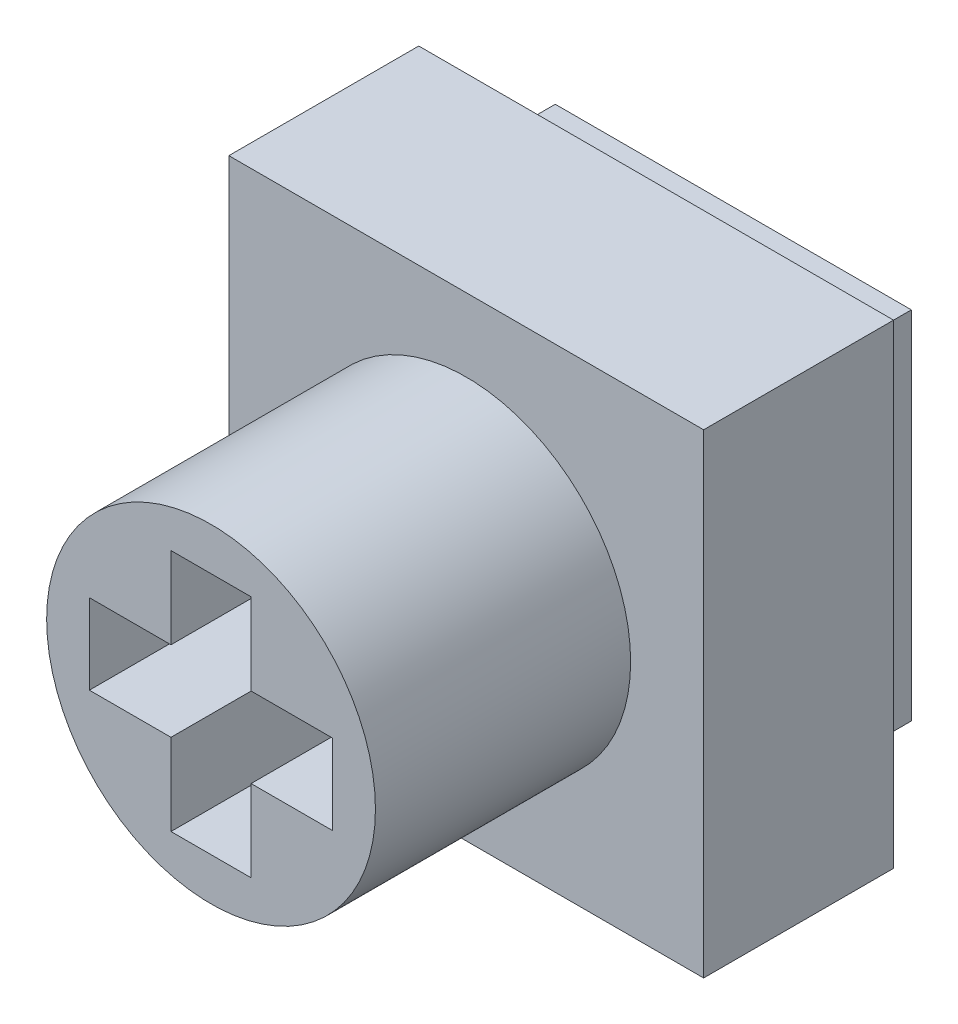
ISO-10303-21;
HEADER;
FILE_DESCRIPTION(('STEP AP214'),'2;1');
FILE_NAME('part.step','',(''),(''),'','','');
FILE_SCHEMA(('AUTOMOTIVE_DESIGN { 1 0 10303 214 1 1 1 1 }'));
ENDSEC;
DATA;
#1=APPLICATION_CONTEXT('core data for automotive mechanical design processes');
#2=APPLICATION_PROTOCOL_DEFINITION('international standard','automotive_design',2000,#1);
#3=PRODUCT_CONTEXT('',#1,'mechanical');
#4=PRODUCT('Part','Part','',(#3));
#5=PRODUCT_RELATED_PRODUCT_CATEGORY('part','',(#4));
#6=PRODUCT_DEFINITION_FORMATION('','',#4);
#7=PRODUCT_DEFINITION_CONTEXT('part definition',#1,'design');
#8=PRODUCT_DEFINITION('design','',#6,#7);
#9=PRODUCT_DEFINITION_SHAPE('','',#8);
#10=(LENGTH_UNIT() NAMED_UNIT(*) SI_UNIT(.MILLI.,.METRE.));
#11=(NAMED_UNIT(*) PLANE_ANGLE_UNIT() SI_UNIT($,.RADIAN.));
#12=(NAMED_UNIT(*) SI_UNIT($,.STERADIAN.) SOLID_ANGLE_UNIT());
#13=UNCERTAINTY_MEASURE_WITH_UNIT(LENGTH_MEASURE(1.E-05),#10,'distance_accuracy_value','');
#14=(GEOMETRIC_REPRESENTATION_CONTEXT(3) GLOBAL_UNCERTAINTY_ASSIGNED_CONTEXT((#13)) GLOBAL_UNIT_ASSIGNED_CONTEXT((#10,
#11,#12)) REPRESENTATION_CONTEXT('',''));
#15=CARTESIAN_POINT('',(0.,0.,0.));
#16=DIRECTION('',(0.,0.,1.));
#17=DIRECTION('',(1.,0.,0.));
#18=AXIS2_PLACEMENT_3D('',#15,#16,#17);
#19=CARTESIAN_POINT('',(0.,0.,0.));
#20=DIRECTION('',(0.,0.,1.));
#21=DIRECTION('',(1.,0.,0.));
#22=AXIS2_PLACEMENT_3D('',#19,#20,#21);
#23=PLANE('',#22);
#24=DIRECTION('',(0.,-1.,0.));
#25=VECTOR('',#24,1.);
#26=CARTESIAN_POINT('',(-3.99761136088125,-19.0657117710836,0.));
#27=LINE('',#26,#25);
#28=CARTESIAN_POINT('',(-3.99761136088125,-19.0657117710836,0.));
#29=VERTEX_POINT('',#28);
#30=CARTESIAN_POINT('',(-3.99761136088125,-27.0657117710836,0.));
#31=VERTEX_POINT('',#30);
#32=EDGE_CURVE('E200',#29,#31,#27,.T.);
#33=ORIENTED_EDGE('',*,*,#32,.F.);
#34=DIRECTION('',(-1.,0.,0.));
#35=VECTOR('',#34,1.);
#36=CARTESIAN_POINT('',(4.00238863911875,-19.0657117710836,0.));
#37=LINE('',#36,#35);
#38=CARTESIAN_POINT('',(4.00238863911875,-19.0657117710836,0.));
#39=VERTEX_POINT('',#38);
#40=EDGE_CURVE('E216',#39,#29,#37,.T.);
#41=ORIENTED_EDGE('',*,*,#40,.F.);
#42=DIRECTION('',(0.,1.,0.));
#43=VECTOR('',#42,1.);
#44=CARTESIAN_POINT('',(4.00238863911875,-19.0657117710836,0.));
#45=LINE('',#44,#43);
#46=CARTESIAN_POINT('',(4.00238863911875,-27.0657117710836,0.));
#47=VERTEX_POINT('',#46);
#48=EDGE_CURVE('E228',#47,#39,#45,.T.);
#49=ORIENTED_EDGE('',*,*,#48,.F.);
#50=DIRECTION('',(1.,0.,0.));
#51=VECTOR('',#50,1.);
#52=CARTESIAN_POINT('',(4.00238863911875,-27.0657117710836,0.));
#53=LINE('',#52,#51);
#54=EDGE_CURVE('E205',#31,#47,#53,.T.);
#55=ORIENTED_EDGE('',*,*,#54,.F.);
#56=EDGE_LOOP('',(#33,#41,#49,#55));
#57=FACE_BOUND('',#56,.T.);
#58=DIRECTION('',(0.,-1.,0.));
#59=VECTOR('',#58,1.);
#60=CARTESIAN_POINT('',(3.00238863911875,-20.0657117710836,0.));
#61=LINE('',#60,#59);
#62=CARTESIAN_POINT('',(3.00238863911875,-20.0657117710836,0.));
#63=VERTEX_POINT('',#62);
#64=CARTESIAN_POINT('',(3.00238863911875,-26.0657117710836,0.));
#65=VERTEX_POINT('',#64);
#66=EDGE_CURVE('E55',#63,#65,#61,.T.);
#67=ORIENTED_EDGE('',*,*,#66,.F.);
#68=DIRECTION('',(1.,0.,0.));
#69=VECTOR('',#68,1.);
#70=CARTESIAN_POINT('',(-2.99761136088125,-20.0657117710836,0.));
#71=LINE('',#70,#69);
#72=CARTESIAN_POINT('',(-2.99761136088125,-20.0657117710836,0.));
#73=VERTEX_POINT('',#72);
#74=EDGE_CURVE('E59',#73,#63,#71,.T.);
#75=ORIENTED_EDGE('',*,*,#74,.F.);
#76=DIRECTION('',(0.,1.,0.));
#77=VECTOR('',#76,1.);
#78=CARTESIAN_POINT('',(-2.99761136088125,-20.0657117710836,0.));
#79=LINE('',#78,#77);
#80=CARTESIAN_POINT('',(-2.99761136088125,-26.0657117710836,0.));
#81=VERTEX_POINT('',#80);
#82=EDGE_CURVE('E655',#81,#73,#79,.T.);
#83=ORIENTED_EDGE('',*,*,#82,.F.);
#84=DIRECTION('',(-1.,0.,0.));
#85=VECTOR('',#84,1.);
#86=CARTESIAN_POINT('',(-2.99761136088125,-26.0657117710836,0.));
#87=LINE('',#86,#85);
#88=EDGE_CURVE('E665',#65,#81,#87,.T.);
#89=ORIENTED_EDGE('',*,*,#88,.F.);
#90=EDGE_LOOP('',(#67,#75,#83,#89));
#91=FACE_BOUND('',#90,.T.);
#92=ADVANCED_FACE('F39',(#57,#91),#23,.F.);
#93=CARTESIAN_POINT('',(0.,-25.1157117710836,7.5));
#94=DIRECTION('',(0.,-1.,0.));
#95=DIRECTION('',(0.,0.,-1.));
#96=AXIS2_PLACEMENT_3D('',#93,#94,#95);
#97=PLANE('',#96);
#98=DIRECTION('',(1.,0.,0.));
#99=VECTOR('',#98,1.);
#100=CARTESIAN_POINT('',(0.,-25.1157117710836,3.2));
#101=LINE('',#100,#99);
#102=CARTESIAN_POINT('',(-0.67261136088125,-25.1157117710836,3.2));
#103=VERTEX_POINT('',#102);
#104=CARTESIAN_POINT('',(0.67738863911875,-25.1157117710836,3.2));
#105=VERTEX_POINT('',#104);
#106=EDGE_CURVE('E287',#103,#105,#101,.T.);
#107=ORIENTED_EDGE('',*,*,#106,.F.);
#108=DIRECTION('',(0.,0.,-1.));
#109=VECTOR('',#108,1.);
#110=CARTESIAN_POINT('',(-0.67261136088125,-25.1157117710836,7.5));
#111=LINE('',#110,#109);
#112=CARTESIAN_POINT('',(-0.67261136088125,-25.1157117710836,7.5));
#113=VERTEX_POINT('',#112);
#114=EDGE_CURVE('E48',#113,#103,#111,.T.);
#115=ORIENTED_EDGE('',*,*,#114,.F.);
#116=DIRECTION('',(-1.,0.,0.));
#117=VECTOR('',#116,1.);
#118=CARTESIAN_POINT('',(0.,-25.1157117710836,7.5));
#119=LINE('',#118,#117);
#120=CARTESIAN_POINT('',(0.67738863911875,-25.1157117710836,7.5));
#121=VERTEX_POINT('',#120);
#122=EDGE_CURVE('E290',#121,#113,#119,.T.);
#123=ORIENTED_EDGE('',*,*,#122,.F.);
#124=DIRECTION('',(0.,0.,-1.));
#125=VECTOR('',#124,1.);
#126=CARTESIAN_POINT('',(0.67738863911875,-25.1157117710836,7.5));
#127=LINE('',#126,#125);
#128=EDGE_CURVE('E327',#121,#105,#127,.T.);
#129=ORIENTED_EDGE('',*,*,#128,.T.);
#130=EDGE_LOOP('',(#107,#115,#123,#129));
#131=FACE_BOUND('',#130,.T.);
#132=ADVANCED_FACE('F41',(#131),#97,.F.);
#133=CARTESIAN_POINT('',(-0.672611360881257,0.,7.5));
#134=DIRECTION('',(-1.,0.,0.));
#135=DIRECTION('',(0.,-1.,0.));
#136=AXIS2_PLACEMENT_3D('',#133,#134,#135);
#137=PLANE('',#136);
#138=DIRECTION('',(0.,-1.,0.));
#139=VECTOR('',#138,1.);
#140=CARTESIAN_POINT('',(-0.672611360881257,0.,3.2));
#141=LINE('',#140,#139);
#142=CARTESIAN_POINT('',(-0.672611360881251,-23.7407117710836,3.2));
#143=VERTEX_POINT('',#142);
#144=EDGE_CURVE('E284',#143,#103,#141,.T.);
#145=ORIENTED_EDGE('',*,*,#144,.F.);
#146=DIRECTION('',(0.,0.,-1.));
#147=VECTOR('',#146,1.);
#148=CARTESIAN_POINT('',(-0.672611360881251,-23.7407117710836,7.5));
#149=LINE('',#148,#147);
#150=CARTESIAN_POINT('',(-0.672611360881251,-23.7407117710836,7.5));
#151=VERTEX_POINT('',#150);
#152=EDGE_CURVE('E367',#151,#143,#149,.T.);
#153=ORIENTED_EDGE('',*,*,#152,.F.);
#154=DIRECTION('',(0.,1.,0.));
#155=VECTOR('',#154,1.);
#156=CARTESIAN_POINT('',(-0.672611360881257,0.,7.5));
#157=LINE('',#156,#155);
#158=EDGE_CURVE('E294',#113,#151,#157,.T.);
#159=ORIENTED_EDGE('',*,*,#158,.F.);
#160=ORIENTED_EDGE('',*,*,#114,.T.);
#161=EDGE_LOOP('',(#145,#153,#159,#160));
#162=FACE_BOUND('',#161,.T.);
#163=ADVANCED_FACE('F375',(#162),#137,.F.);
#164=CARTESIAN_POINT('',(0.,-23.7407117710836,7.5));
#165=DIRECTION('',(0.,1.,0.));
#166=DIRECTION('',(0.,0.,1.));
#167=AXIS2_PLACEMENT_3D('',#164,#165,#166);
#168=PLANE('',#167);
#169=ORIENTED_EDGE('',*,*,#152,.T.);
#170=DIRECTION('',(-1.,0.,0.));
#171=VECTOR('',#170,1.);
#172=CARTESIAN_POINT('',(0.,-23.7407117710836,3.2));
#173=LINE('',#172,#171);
#174=CARTESIAN_POINT('',(-2.04761136088125,-23.7407117710836,3.2));
#175=VERTEX_POINT('',#174);
#176=EDGE_CURVE('E280',#143,#175,#173,.T.);
#177=ORIENTED_EDGE('',*,*,#176,.T.);
#178=DIRECTION('',(0.,0.,-1.));
#179=VECTOR('',#178,1.);
#180=CARTESIAN_POINT('',(-2.04761136088125,-23.7407117710836,7.5));
#181=LINE('',#180,#179);
#182=CARTESIAN_POINT('',(-2.04761136088125,-23.7407117710836,7.5));
#183=VERTEX_POINT('',#182);
#184=EDGE_CURVE('E363',#183,#175,#181,.T.);
#185=ORIENTED_EDGE('',*,*,#184,.F.);
#186=DIRECTION('',(1.,0.,0.));
#187=VECTOR('',#186,1.);
#188=CARTESIAN_POINT('',(0.,-23.7407117710836,7.5));
#189=LINE('',#188,#187);
#190=EDGE_CURVE('E297',#183,#151,#189,.T.);
#191=ORIENTED_EDGE('',*,*,#190,.T.);
#192=EDGE_LOOP('',(#169,#177,#185,#191));
#193=FACE_BOUND('',#192,.T.);
#194=ADVANCED_FACE('F427',(#193),#168,.T.);
#195=CARTESIAN_POINT('',(-2.04761136088124,0.,7.5));
#196=DIRECTION('',(1.,0.,0.));
#197=DIRECTION('',(0.,1.,0.));
#198=AXIS2_PLACEMENT_3D('',#195,#196,#197);
#199=PLANE('',#198);
#200=ORIENTED_EDGE('',*,*,#184,.T.);
#201=DIRECTION('',(0.,1.,0.));
#202=VECTOR('',#201,1.);
#203=CARTESIAN_POINT('',(-2.04761136088124,0.,3.2));
#204=LINE('',#203,#202);
#205=CARTESIAN_POINT('',(-2.04761136088125,-22.3907117710836,3.2));
#206=VERTEX_POINT('',#205);
#207=EDGE_CURVE('E276',#175,#206,#204,.T.);
#208=ORIENTED_EDGE('',*,*,#207,.T.);
#209=DIRECTION('',(0.,0.,-1.));
#210=VECTOR('',#209,1.);
#211=CARTESIAN_POINT('',(-2.04761136088125,-22.3907117710836,7.5));
#212=LINE('',#211,#210);
#213=CARTESIAN_POINT('',(-2.04761136088125,-22.3907117710836,7.5));
#214=VERTEX_POINT('',#213);
#215=EDGE_CURVE('E359',#214,#206,#212,.T.);
#216=ORIENTED_EDGE('',*,*,#215,.F.);
#217=DIRECTION('',(0.,-1.,0.));
#218=VECTOR('',#217,1.);
#219=CARTESIAN_POINT('',(-2.04761136088124,0.,7.5));
#220=LINE('',#219,#218);
#221=EDGE_CURVE('E302',#214,#183,#220,.T.);
#222=ORIENTED_EDGE('',*,*,#221,.T.);
#223=EDGE_LOOP('',(#200,#208,#216,#222));
#224=FACE_BOUND('',#223,.T.);
#225=ADVANCED_FACE('F425',(#224),#199,.T.);
#226=CARTESIAN_POINT('',(0.,-22.3907117710836,7.5));
#227=DIRECTION('',(0.,1.,0.));
#228=DIRECTION('',(0.,0.,1.));
#229=AXIS2_PLACEMENT_3D('',#226,#227,#228);
#230=PLANE('',#229);
#231=DIRECTION('',(-1.,0.,0.));
#232=VECTOR('',#231,1.);
#233=CARTESIAN_POINT('',(0.,-22.3907117710836,3.2));
#234=LINE('',#233,#232);
#235=CARTESIAN_POINT('',(-0.672611360881251,-22.3907117710836,3.2));
#236=VERTEX_POINT('',#235);
#237=EDGE_CURVE('E273',#236,#206,#234,.T.);
#238=ORIENTED_EDGE('',*,*,#237,.F.);
#239=DIRECTION('',(0.,0.,-1.));
#240=VECTOR('',#239,1.);
#241=CARTESIAN_POINT('',(-0.672611360881251,-22.3907117710836,7.5));
#242=LINE('',#241,#240);
#243=CARTESIAN_POINT('',(-0.672611360881251,-22.3907117710836,7.5));
#244=VERTEX_POINT('',#243);
#245=EDGE_CURVE('E355',#244,#236,#242,.T.);
#246=ORIENTED_EDGE('',*,*,#245,.F.);
#247=DIRECTION('',(1.,0.,0.));
#248=VECTOR('',#247,1.);
#249=CARTESIAN_POINT('',(0.,-22.3907117710836,7.5));
#250=LINE('',#249,#248);
#251=EDGE_CURVE('E307',#214,#244,#250,.T.);
#252=ORIENTED_EDGE('',*,*,#251,.F.);
#253=ORIENTED_EDGE('',*,*,#215,.T.);
#254=EDGE_LOOP('',(#238,#246,#252,#253));
#255=FACE_BOUND('',#254,.T.);
#256=ADVANCED_FACE('F423',(#255),#230,.F.);
#257=DIRECTION('',(0.,-1.,0.));
#258=VECTOR('',#257,1.);
#259=CARTESIAN_POINT('',(-0.672611360881257,0.,3.2));
#260=LINE('',#259,#258);
#261=CARTESIAN_POINT('',(-0.672611360881251,-21.0157117710836,3.2));
#262=VERTEX_POINT('',#261);
#263=EDGE_CURVE('E270',#262,#236,#260,.T.);
#264=ORIENTED_EDGE('',*,*,#263,.F.);
#265=DIRECTION('',(0.,0.,-1.));
#266=VECTOR('',#265,1.);
#267=CARTESIAN_POINT('',(-0.672611360881251,-21.0157117710836,7.5));
#268=LINE('',#267,#266);
#269=CARTESIAN_POINT('',(-0.672611360881251,-21.0157117710836,7.5));
#270=VERTEX_POINT('',#269);
#271=EDGE_CURVE('E351',#270,#262,#268,.T.);
#272=ORIENTED_EDGE('',*,*,#271,.F.);
#273=EDGE_CURVE('E298',#244,#270,#157,.T.);
#274=ORIENTED_EDGE('',*,*,#273,.F.);
#275=ORIENTED_EDGE('',*,*,#245,.T.);
#276=EDGE_LOOP('',(#264,#272,#274,#275));
#277=FACE_BOUND('',#276,.T.);
#278=ADVANCED_FACE('F408',(#277),#137,.F.);
#279=CARTESIAN_POINT('',(0.,-21.0157117710836,7.5));
#280=DIRECTION('',(0.,-1.,0.));
#281=DIRECTION('',(0.,0.,-1.));
#282=AXIS2_PLACEMENT_3D('',#279,#280,#281);
#283=PLANE('',#282);
#284=ORIENTED_EDGE('',*,*,#271,.T.);
#285=DIRECTION('',(1.,0.,0.));
#286=VECTOR('',#285,1.);
#287=CARTESIAN_POINT('',(0.,-21.0157117710836,3.2));
#288=LINE('',#287,#286);
#289=CARTESIAN_POINT('',(0.677388639118749,-21.0157117710836,3.2));
#290=VERTEX_POINT('',#289);
#291=EDGE_CURVE('E266',#262,#290,#288,.T.);
#292=ORIENTED_EDGE('',*,*,#291,.T.);
#293=DIRECTION('',(0.,0.,-1.));
#294=VECTOR('',#293,1.);
#295=CARTESIAN_POINT('',(0.677388639118749,-21.0157117710836,7.5));
#296=LINE('',#295,#294);
#297=CARTESIAN_POINT('',(0.677388639118749,-21.0157117710836,7.5));
#298=VERTEX_POINT('',#297);
#299=EDGE_CURVE('E347',#298,#290,#296,.T.);
#300=ORIENTED_EDGE('',*,*,#299,.F.);
#301=DIRECTION('',(-1.,0.,0.));
#302=VECTOR('',#301,1.);
#303=CARTESIAN_POINT('',(0.,-21.0157117710836,7.5));
#304=LINE('',#303,#302);
#305=EDGE_CURVE('E311',#298,#270,#304,.T.);
#306=ORIENTED_EDGE('',*,*,#305,.T.);
#307=EDGE_LOOP('',(#284,#292,#300,#306));
#308=FACE_BOUND('',#307,.T.);
#309=ADVANCED_FACE('F410',(#308),#283,.T.);
#310=CARTESIAN_POINT('',(0.677388639118743,0.,7.5));
#311=DIRECTION('',(-1.,0.,0.));
#312=DIRECTION('',(0.,-1.,0.));
#313=AXIS2_PLACEMENT_3D('',#310,#311,#312);
#314=PLANE('',#313);
#315=ORIENTED_EDGE('',*,*,#299,.T.);
#316=DIRECTION('',(0.,-1.,0.));
#317=VECTOR('',#316,1.);
#318=CARTESIAN_POINT('',(0.677388639118743,0.,3.2));
#319=LINE('',#318,#317);
#320=CARTESIAN_POINT('',(0.67738863911875,-22.3907117710836,3.2));
#321=VERTEX_POINT('',#320);
#322=EDGE_CURVE('E262',#290,#321,#319,.T.);
#323=ORIENTED_EDGE('',*,*,#322,.T.);
#324=DIRECTION('',(0.,0.,-1.));
#325=VECTOR('',#324,1.);
#326=CARTESIAN_POINT('',(0.67738863911875,-22.3907117710836,7.5));
#327=LINE('',#326,#325);
#328=CARTESIAN_POINT('',(0.67738863911875,-22.3907117710836,7.5));
#329=VERTEX_POINT('',#328);
#330=EDGE_CURVE('E343',#329,#321,#327,.T.);
#331=ORIENTED_EDGE('',*,*,#330,.F.);
#332=DIRECTION('',(0.,1.,0.));
#333=VECTOR('',#332,1.);
#334=CARTESIAN_POINT('',(0.677388639118743,0.,7.5));
#335=LINE('',#334,#333);
#336=EDGE_CURVE('E315',#329,#298,#335,.T.);
#337=ORIENTED_EDGE('',*,*,#336,.T.);
#338=EDGE_LOOP('',(#315,#323,#331,#337));
#339=FACE_BOUND('',#338,.T.);
#340=ADVANCED_FACE('F412',(#339),#314,.T.);
#341=DIRECTION('',(-1.,0.,0.));
#342=VECTOR('',#341,1.);
#343=CARTESIAN_POINT('',(0.,-22.3907117710836,3.2));
#344=LINE('',#343,#342);
#345=CARTESIAN_POINT('',(2.05238863911875,-22.3907117710836,3.2));
#346=VERTEX_POINT('',#345);
#347=EDGE_CURVE('E259',#346,#321,#344,.T.);
#348=ORIENTED_EDGE('',*,*,#347,.F.);
#349=DIRECTION('',(0.,0.,-1.));
#350=VECTOR('',#349,1.);
#351=CARTESIAN_POINT('',(2.05238863911875,-22.3907117710836,7.5));
#352=LINE('',#351,#350);
#353=CARTESIAN_POINT('',(2.05238863911875,-22.3907117710836,7.5));
#354=VERTEX_POINT('',#353);
#355=EDGE_CURVE('E339',#354,#346,#352,.T.);
#356=ORIENTED_EDGE('',*,*,#355,.F.);
#357=EDGE_CURVE('E310',#329,#354,#250,.T.);
#358=ORIENTED_EDGE('',*,*,#357,.F.);
#359=ORIENTED_EDGE('',*,*,#330,.T.);
#360=EDGE_LOOP('',(#348,#356,#358,#359));
#361=FACE_BOUND('',#360,.T.);
#362=ADVANCED_FACE('F417',(#361),#230,.F.);
#363=CARTESIAN_POINT('',(2.05238863911875,0.,7.5));
#364=DIRECTION('',(1.,0.,0.));
#365=DIRECTION('',(0.,0.,-1.));
#366=AXIS2_PLACEMENT_3D('',#363,#364,#365);
#367=PLANE('',#366);
#368=DIRECTION('',(0.,1.,0.));
#369=VECTOR('',#368,1.);
#370=CARTESIAN_POINT('',(2.05238863911875,0.,3.2));
#371=LINE('',#370,#369);
#372=CARTESIAN_POINT('',(2.05238863911875,-23.7407117710836,3.2));
#373=VERTEX_POINT('',#372);
#374=EDGE_CURVE('E256',#373,#346,#371,.T.);
#375=ORIENTED_EDGE('',*,*,#374,.F.);
#376=DIRECTION('',(0.,0.,-1.));
#377=VECTOR('',#376,1.);
#378=CARTESIAN_POINT('',(2.05238863911875,-23.7407117710836,7.5));
#379=LINE('',#378,#377);
#380=CARTESIAN_POINT('',(2.05238863911875,-23.7407117710836,7.5));
#381=VERTEX_POINT('',#380);
#382=EDGE_CURVE('E335',#381,#373,#379,.T.);
#383=ORIENTED_EDGE('',*,*,#382,.F.);
#384=DIRECTION('',(0.,-1.,0.));
#385=VECTOR('',#384,1.);
#386=CARTESIAN_POINT('',(2.05238863911875,0.,7.5));
#387=LINE('',#386,#385);
#388=EDGE_CURVE('E320',#354,#381,#387,.T.);
#389=ORIENTED_EDGE('',*,*,#388,.F.);
#390=ORIENTED_EDGE('',*,*,#355,.T.);
#391=EDGE_LOOP('',(#375,#383,#389,#390));
#392=FACE_BOUND('',#391,.T.);
#393=ADVANCED_FACE('F420',(#392),#367,.F.);
#394=ORIENTED_EDGE('',*,*,#382,.T.);
#395=DIRECTION('',(-1.,0.,0.));
#396=VECTOR('',#395,1.);
#397=CARTESIAN_POINT('',(0.,-23.7407117710836,3.2));
#398=LINE('',#397,#396);
#399=CARTESIAN_POINT('',(0.67738863911875,-23.7407117710836,3.2));
#400=VERTEX_POINT('',#399);
#401=EDGE_CURVE('E252',#373,#400,#398,.T.);
#402=ORIENTED_EDGE('',*,*,#401,.T.);
#403=DIRECTION('',(0.,0.,-1.));
#404=VECTOR('',#403,1.);
#405=CARTESIAN_POINT('',(0.67738863911875,-23.7407117710836,7.5));
#406=LINE('',#405,#404);
#407=CARTESIAN_POINT('',(0.67738863911875,-23.7407117710836,7.5));
#408=VERTEX_POINT('',#407);
#409=EDGE_CURVE('E331',#408,#400,#406,.T.);
#410=ORIENTED_EDGE('',*,*,#409,.F.);
#411=EDGE_CURVE('E303',#408,#381,#189,.T.);
#412=ORIENTED_EDGE('',*,*,#411,.T.);
#413=EDGE_LOOP('',(#394,#402,#410,#412));
#414=FACE_BOUND('',#413,.T.);
#415=ADVANCED_FACE('F389',(#414),#168,.T.);
#416=ORIENTED_EDGE('',*,*,#409,.T.);
#417=DIRECTION('',(0.,-1.,0.));
#418=VECTOR('',#417,1.);
#419=CARTESIAN_POINT('',(0.677388639118743,0.,3.2));
#420=LINE('',#419,#418);
#421=EDGE_CURVE('E248',#400,#105,#420,.T.);
#422=ORIENTED_EDGE('',*,*,#421,.T.);
#423=ORIENTED_EDGE('',*,*,#128,.F.);
#424=EDGE_CURVE('E319',#121,#408,#335,.T.);
#425=ORIENTED_EDGE('',*,*,#424,.T.);
#426=EDGE_LOOP('',(#416,#422,#423,#425));
#427=FACE_BOUND('',#426,.T.);
#428=ADVANCED_FACE('F384',(#427),#314,.T.);
#429=CARTESIAN_POINT('',(0.00238863911875002,-23.0657117710836,7.5));
#430=DIRECTION('',(0.,0.,-1.));
#431=DIRECTION('',(-1.,0.,0.));
#432=AXIS2_PLACEMENT_3D('',#429,#430,#431);
#433=CYLINDRICAL_SURFACE('',#432,2.77);
#434=CARTESIAN_POINT('',(0.00238863911875002,-23.0657117710836,7.5));
#435=DIRECTION('',(0.,0.,1.));
#436=DIRECTION('',(1.,0.,0.));
#437=AXIS2_PLACEMENT_3D('',#434,#435,#436);
#438=CIRCLE('',#437,2.77);
#439=CARTESIAN_POINT('',(2.77238863911875,-23.0657117710836,7.5));
#440=VERTEX_POINT('',#439);
#441=EDGE_CURVE('E323',#440,#440,#438,.T.);
#442=ORIENTED_EDGE('',*,*,#441,.F.);
#443=EDGE_LOOP('',(#442));
#444=FACE_BOUND('',#443,.T.);
#445=CARTESIAN_POINT('',(0.00238863911875002,-23.0657117710836,3.2));
#446=DIRECTION('',(0.,0.,-1.));
#447=DIRECTION('',(-1.,0.,0.));
#448=AXIS2_PLACEMENT_3D('',#445,#446,#447);
#449=CIRCLE('',#448,2.77);
#450=CARTESIAN_POINT('',(-2.76761136088125,-23.0657117710836,3.2));
#451=VERTEX_POINT('',#450);
#452=EDGE_CURVE('E11',#451,#451,#449,.T.);
#453=ORIENTED_EDGE('',*,*,#452,.F.);
#454=EDGE_LOOP('',(#453));
#455=FACE_BOUND('',#454,.T.);
#456=ADVANCED_FACE('F449',(#444,#455),#433,.T.);
#457=CARTESIAN_POINT('',(0.,0.,7.5));
#458=DIRECTION('',(0.,0.,1.));
#459=DIRECTION('',(1.,0.,0.));
#460=AXIS2_PLACEMENT_3D('',#457,#458,#459);
#461=PLANE('',#460);
#462=ORIENTED_EDGE('',*,*,#122,.T.);
#463=ORIENTED_EDGE('',*,*,#158,.T.);
#464=ORIENTED_EDGE('',*,*,#190,.F.);
#465=ORIENTED_EDGE('',*,*,#221,.F.);
#466=ORIENTED_EDGE('',*,*,#251,.T.);
#467=ORIENTED_EDGE('',*,*,#273,.T.);
#468=ORIENTED_EDGE('',*,*,#305,.F.);
#469=ORIENTED_EDGE('',*,*,#336,.F.);
#470=ORIENTED_EDGE('',*,*,#357,.T.);
#471=ORIENTED_EDGE('',*,*,#388,.T.);
#472=ORIENTED_EDGE('',*,*,#411,.F.);
#473=ORIENTED_EDGE('',*,*,#424,.F.);
#474=EDGE_LOOP('',(#462,#463,#464,#465,#466,#467,#468,#469,#470,#471,#472,#473));
#475=FACE_BOUND('',#474,.T.);
#476=ORIENTED_EDGE('',*,*,#441,.T.);
#477=EDGE_LOOP('',(#476));
#478=FACE_BOUND('',#477,.T.);
#479=ADVANCED_FACE('F391',(#475,#478),#461,.T.);
#480=CARTESIAN_POINT('',(0.,0.,3.2));
#481=DIRECTION('',(0.,0.,-1.));
#482=DIRECTION('',(-1.,0.,0.));
#483=AXIS2_PLACEMENT_3D('',#480,#481,#482);
#484=PLANE('',#483);
#485=ORIENTED_EDGE('',*,*,#452,.T.);
#486=EDGE_LOOP('',(#485));
#487=FACE_BOUND('',#486,.T.);
#488=DIRECTION('',(0.,-1.,0.));
#489=VECTOR('',#488,1.);
#490=CARTESIAN_POINT('',(-3.99761136088125,-19.0657117710836,3.2));
#491=LINE('',#490,#489);
#492=CARTESIAN_POINT('',(-3.99761136088125,-19.0657117710836,3.2));
#493=VERTEX_POINT('',#492);
#494=CARTESIAN_POINT('',(-3.99761136088125,-27.0657117710836,3.2));
#495=VERTEX_POINT('',#494);
#496=EDGE_CURVE('E211',#493,#495,#491,.T.);
#497=ORIENTED_EDGE('',*,*,#496,.T.);
#498=DIRECTION('',(1.,0.,0.));
#499=VECTOR('',#498,1.);
#500=CARTESIAN_POINT('',(4.00238863911875,-27.0657117710836,3.2));
#501=LINE('',#500,#499);
#502=CARTESIAN_POINT('',(4.00238863911875,-27.0657117710836,3.2));
#503=VERTEX_POINT('',#502);
#504=EDGE_CURVE('E215',#495,#503,#501,.T.);
#505=ORIENTED_EDGE('',*,*,#504,.T.);
#506=DIRECTION('',(0.,1.,0.));
#507=VECTOR('',#506,1.);
#508=CARTESIAN_POINT('',(4.00238863911875,-19.0657117710836,3.2));
#509=LINE('',#508,#507);
#510=CARTESIAN_POINT('',(4.00238863911875,-19.0657117710836,3.2));
#511=VERTEX_POINT('',#510);
#512=EDGE_CURVE('E219',#503,#511,#509,.T.);
#513=ORIENTED_EDGE('',*,*,#512,.T.);
#514=DIRECTION('',(-1.,0.,0.));
#515=VECTOR('',#514,1.);
#516=CARTESIAN_POINT('',(4.00238863911875,-19.0657117710836,3.2));
#517=LINE('',#516,#515);
#518=EDGE_CURVE('E222',#511,#493,#517,.T.);
#519=ORIENTED_EDGE('',*,*,#518,.T.);
#520=EDGE_LOOP('',(#497,#505,#513,#519));
#521=FACE_BOUND('',#520,.T.);
#522=ADVANCED_FACE('F476',(#487,#521),#484,.F.);
#523=CARTESIAN_POINT('',(4.00238863911875,-19.0657117710836,3.2));
#524=DIRECTION('',(0.,-1.,0.));
#525=DIRECTION('',(0.,0.,-1.));
#526=AXIS2_PLACEMENT_3D('',#523,#524,#525);
#527=PLANE('',#526);
#528=ORIENTED_EDGE('',*,*,#40,.T.);
#529=DIRECTION('',(0.,0.,-1.));
#530=VECTOR('',#529,1.);
#531=CARTESIAN_POINT('',(-3.99761136088125,-19.0657117710836,3.2));
#532=LINE('',#531,#530);
#533=EDGE_CURVE('E224',#493,#29,#532,.T.);
#534=ORIENTED_EDGE('',*,*,#533,.F.);
#535=ORIENTED_EDGE('',*,*,#518,.F.);
#536=DIRECTION('',(0.,0.,-1.));
#537=VECTOR('',#536,1.);
#538=CARTESIAN_POINT('',(4.00238863911875,-19.0657117710836,3.2));
#539=LINE('',#538,#537);
#540=EDGE_CURVE('E236',#511,#39,#539,.T.);
#541=ORIENTED_EDGE('',*,*,#540,.T.);
#542=EDGE_LOOP('',(#528,#534,#535,#541));
#543=FACE_BOUND('',#542,.T.);
#544=ADVANCED_FACE('F482',(#543),#527,.F.);
#545=CARTESIAN_POINT('',(4.00238863911875,-19.0657117710836,3.2));
#546=DIRECTION('',(-1.,0.,0.));
#547=DIRECTION('',(0.,0.,1.));
#548=AXIS2_PLACEMENT_3D('',#545,#546,#547);
#549=PLANE('',#548);
#550=ORIENTED_EDGE('',*,*,#48,.T.);
#551=ORIENTED_EDGE('',*,*,#540,.F.);
#552=ORIENTED_EDGE('',*,*,#512,.F.);
#553=DIRECTION('',(0.,0.,-1.));
#554=VECTOR('',#553,1.);
#555=CARTESIAN_POINT('',(4.00238863911875,-27.0657117710836,3.2));
#556=LINE('',#555,#554);
#557=EDGE_CURVE('E240',#503,#47,#556,.T.);
#558=ORIENTED_EDGE('',*,*,#557,.T.);
#559=EDGE_LOOP('',(#550,#551,#552,#558));
#560=FACE_BOUND('',#559,.T.);
#561=ADVANCED_FACE('F490',(#560),#549,.F.);
#562=CARTESIAN_POINT('',(4.00238863911875,-27.0657117710836,3.2));
#563=DIRECTION('',(0.,1.,0.));
#564=DIRECTION('',(0.,0.,1.));
#565=AXIS2_PLACEMENT_3D('',#562,#563,#564);
#566=PLANE('',#565);
#567=ORIENTED_EDGE('',*,*,#54,.T.);
#568=ORIENTED_EDGE('',*,*,#557,.F.);
#569=ORIENTED_EDGE('',*,*,#504,.F.);
#570=DIRECTION('',(0.,0.,-1.));
#571=VECTOR('',#570,1.);
#572=CARTESIAN_POINT('',(-3.99761136088125,-27.0657117710836,3.2));
#573=LINE('',#572,#571);
#574=EDGE_CURVE('E244',#495,#31,#573,.T.);
#575=ORIENTED_EDGE('',*,*,#574,.T.);
#576=EDGE_LOOP('',(#567,#568,#569,#575));
#577=FACE_BOUND('',#576,.T.);
#578=ADVANCED_FACE('F498',(#577),#566,.F.);
#579=CARTESIAN_POINT('',(-3.99761136088125,-19.0657117710836,3.2));
#580=DIRECTION('',(1.,0.,0.));
#581=DIRECTION('',(0.,0.,-1.));
#582=AXIS2_PLACEMENT_3D('',#579,#580,#581);
#583=PLANE('',#582);
#584=ORIENTED_EDGE('',*,*,#32,.T.);
#585=ORIENTED_EDGE('',*,*,#574,.F.);
#586=ORIENTED_EDGE('',*,*,#496,.F.);
#587=ORIENTED_EDGE('',*,*,#533,.T.);
#588=EDGE_LOOP('',(#584,#585,#586,#587));
#589=FACE_BOUND('',#588,.T.);
#590=ADVANCED_FACE('F506',(#589),#583,.F.);
#591=ORIENTED_EDGE('',*,*,#144,.T.);
#592=ORIENTED_EDGE('',*,*,#106,.T.);
#593=ORIENTED_EDGE('',*,*,#421,.F.);
#594=ORIENTED_EDGE('',*,*,#401,.F.);
#595=ORIENTED_EDGE('',*,*,#374,.T.);
#596=ORIENTED_EDGE('',*,*,#347,.T.);
#597=ORIENTED_EDGE('',*,*,#322,.F.);
#598=ORIENTED_EDGE('',*,*,#291,.F.);
#599=ORIENTED_EDGE('',*,*,#263,.T.);
#600=ORIENTED_EDGE('',*,*,#237,.T.);
#601=ORIENTED_EDGE('',*,*,#207,.F.);
#602=ORIENTED_EDGE('',*,*,#176,.F.);
#603=EDGE_LOOP('',(#591,#592,#593,#594,#595,#596,#597,#598,#599,#600,#601,#602));
#604=FACE_BOUND('',#603,.T.);
#605=ADVANCED_FACE('F382',(#604),#484,.F.);
#606=CARTESIAN_POINT('',(3.00238863911875,-20.0657117710836,-1.3));
#607=DIRECTION('',(-1.,0.,0.));
#608=DIRECTION('',(0.,-1.,0.));
#609=AXIS2_PLACEMENT_3D('',#606,#607,#608);
#610=PLANE('',#609);
#611=ORIENTED_EDGE('',*,*,#66,.T.);
#612=DIRECTION('',(0.,0.,1.));
#613=VECTOR('',#612,1.);
#614=CARTESIAN_POINT('',(3.00238863911875,-26.0657117710836,-1.3));
#615=LINE('',#614,#613);
#616=CARTESIAN_POINT('',(3.00238863911875,-26.0657117710836,-1.3));
#617=VERTEX_POINT('',#616);
#618=EDGE_CURVE('E180',#617,#65,#615,.T.);
#619=ORIENTED_EDGE('',*,*,#618,.F.);
#620=DIRECTION('',(0.,-1.,0.));
#621=VECTOR('',#620,1.);
#622=CARTESIAN_POINT('',(3.00238863911875,-20.0657117710836,-1.3));
#623=LINE('',#622,#621);
#624=CARTESIAN_POINT('',(3.00238863911875,-20.0657117710836,-1.3));
#625=VERTEX_POINT('',#624);
#626=EDGE_CURVE('E187',#625,#617,#623,.T.);
#627=ORIENTED_EDGE('',*,*,#626,.F.);
#628=DIRECTION('',(0.,0.,1.));
#629=VECTOR('',#628,1.);
#630=CARTESIAN_POINT('',(3.00238863911875,-20.0657117710836,-1.3));
#631=LINE('',#630,#629);
#632=EDGE_CURVE('E652',#625,#63,#631,.T.);
#633=ORIENTED_EDGE('',*,*,#632,.T.);
#634=EDGE_LOOP('',(#611,#619,#627,#633));
#635=FACE_BOUND('',#634,.T.);
#636=ADVANCED_FACE('F198',(#635),#610,.F.);
#637=CARTESIAN_POINT('',(-2.99761136088125,-26.0657117710836,-1.3));
#638=DIRECTION('',(0.,1.,0.));
#639=DIRECTION('',(0.,0.,1.));
#640=AXIS2_PLACEMENT_3D('',#637,#638,#639);
#641=PLANE('',#640);
#642=ORIENTED_EDGE('',*,*,#88,.T.);
#643=DIRECTION('',(0.,0.,1.));
#644=VECTOR('',#643,1.);
#645=CARTESIAN_POINT('',(-2.99761136088125,-26.0657117710836,-1.3));
#646=LINE('',#645,#644);
#647=CARTESIAN_POINT('',(-2.99761136088125,-26.0657117710836,-1.3));
#648=VERTEX_POINT('',#647);
#649=EDGE_CURVE('E182',#648,#81,#646,.T.);
#650=ORIENTED_EDGE('',*,*,#649,.F.);
#651=DIRECTION('',(-1.,0.,0.));
#652=VECTOR('',#651,1.);
#653=CARTESIAN_POINT('',(-2.99761136088125,-26.0657117710836,-1.3));
#654=LINE('',#653,#652);
#655=EDGE_CURVE('E175',#617,#648,#654,.T.);
#656=ORIENTED_EDGE('',*,*,#655,.F.);
#657=ORIENTED_EDGE('',*,*,#618,.T.);
#658=EDGE_LOOP('',(#642,#650,#656,#657));
#659=FACE_BOUND('',#658,.T.);
#660=ADVANCED_FACE('F178',(#659),#641,.F.);
#661=CARTESIAN_POINT('',(-2.99761136088125,-20.0657117710836,-1.3));
#662=DIRECTION('',(1.,0.,0.));
#663=DIRECTION('',(0.,1.,0.));
#664=AXIS2_PLACEMENT_3D('',#661,#662,#663);
#665=PLANE('',#664);
#666=ORIENTED_EDGE('',*,*,#82,.T.);
#667=DIRECTION('',(0.,0.,1.));
#668=VECTOR('',#667,1.);
#669=CARTESIAN_POINT('',(-2.99761136088125,-20.0657117710836,-1.3));
#670=LINE('',#669,#668);
#671=CARTESIAN_POINT('',(-2.99761136088125,-20.0657117710836,-1.3));
#672=VERTEX_POINT('',#671);
#673=EDGE_CURVE('E207',#672,#73,#670,.T.);
#674=ORIENTED_EDGE('',*,*,#673,.F.);
#675=DIRECTION('',(0.,1.,0.));
#676=VECTOR('',#675,1.);
#677=CARTESIAN_POINT('',(-2.99761136088125,-20.0657117710836,-1.3));
#678=LINE('',#677,#676);
#679=EDGE_CURVE('E186',#648,#672,#678,.T.);
#680=ORIENTED_EDGE('',*,*,#679,.F.);
#681=ORIENTED_EDGE('',*,*,#649,.T.);
#682=EDGE_LOOP('',(#666,#674,#680,#681));
#683=FACE_BOUND('',#682,.T.);
#684=ADVANCED_FACE('F531',(#683),#665,.F.);
#685=CARTESIAN_POINT('',(-2.99761136088125,-20.0657117710836,-1.3));
#686=DIRECTION('',(0.,-1.,0.));
#687=DIRECTION('',(0.,0.,-1.));
#688=AXIS2_PLACEMENT_3D('',#685,#686,#687);
#689=PLANE('',#688);
#690=ORIENTED_EDGE('',*,*,#74,.T.);
#691=ORIENTED_EDGE('',*,*,#632,.F.);
#692=DIRECTION('',(1.,0.,0.));
#693=VECTOR('',#692,1.);
#694=CARTESIAN_POINT('',(-2.99761136088125,-20.0657117710836,-1.3));
#695=LINE('',#694,#693);
#696=EDGE_CURVE('E192',#672,#625,#695,.T.);
#697=ORIENTED_EDGE('',*,*,#696,.F.);
#698=ORIENTED_EDGE('',*,*,#673,.T.);
#699=EDGE_LOOP('',(#690,#691,#697,#698));
#700=FACE_BOUND('',#699,.T.);
#701=ADVANCED_FACE('F538',(#700),#689,.F.);
#702=CARTESIAN_POINT('',(0.,0.,-1.3));
#703=DIRECTION('',(0.,0.,1.));
#704=DIRECTION('',(1.,0.,0.));
#705=AXIS2_PLACEMENT_3D('',#702,#703,#704);
#706=PLANE('',#705);
#707=ORIENTED_EDGE('',*,*,#626,.T.);
#708=ORIENTED_EDGE('',*,*,#655,.T.);
#709=ORIENTED_EDGE('',*,*,#679,.T.);
#710=ORIENTED_EDGE('',*,*,#696,.T.);
#711=EDGE_LOOP('',(#707,#708,#709,#710));
#712=FACE_BOUND('',#711,.T.);
#713=ADVANCED_FACE('F190',(#712),#706,.F.);
#714=CLOSED_SHELL('',(#92,#132,#163,#194,#225,#256,#278,#309,#340,#362,#393,#415,#428,#456,#479,
#522,#544,#561,#578,#590,#605,#636,#660,#684,#701,#713));
#715=MANIFOLD_SOLID_BREP('B2',#714);
#716=ADVANCED_BREP_SHAPE_REPRESENTATION('',(#18,#715),#14);
#717=SHAPE_DEFINITION_REPRESENTATION(#9,#716);
ENDSEC;
END-ISO-10303-21;
